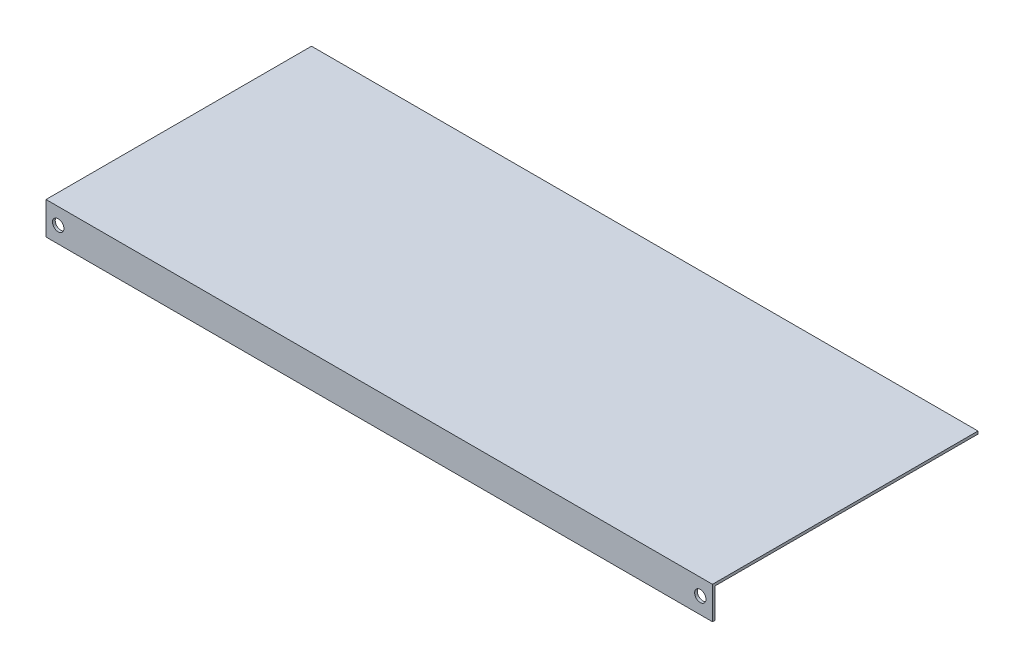
ISO-10303-21;
HEADER;
FILE_DESCRIPTION(('STEP AP214'),'2;1');
FILE_NAME('part.step','',(''),(''),'','','');
FILE_SCHEMA(('AUTOMOTIVE_DESIGN { 1 0 10303 214 1 1 1 1 }'));
ENDSEC;
DATA;
#1=APPLICATION_CONTEXT('core data for automotive mechanical design processes');
#2=APPLICATION_PROTOCOL_DEFINITION('international standard','automotive_design',2000,#1);
#3=PRODUCT_CONTEXT('',#1,'mechanical');
#4=PRODUCT('Part','Part','',(#3));
#5=PRODUCT_RELATED_PRODUCT_CATEGORY('part','',(#4));
#6=PRODUCT_DEFINITION_FORMATION('','',#4);
#7=PRODUCT_DEFINITION_CONTEXT('part definition',#1,'design');
#8=PRODUCT_DEFINITION('design','',#6,#7);
#9=PRODUCT_DEFINITION_SHAPE('','',#8);
#10=(LENGTH_UNIT() NAMED_UNIT(*) SI_UNIT(.MILLI.,.METRE.));
#11=(NAMED_UNIT(*) PLANE_ANGLE_UNIT() SI_UNIT($,.RADIAN.));
#12=(NAMED_UNIT(*) SI_UNIT($,.STERADIAN.) SOLID_ANGLE_UNIT());
#13=UNCERTAINTY_MEASURE_WITH_UNIT(LENGTH_MEASURE(1.E-05),#10,'distance_accuracy_value','');
#14=(GEOMETRIC_REPRESENTATION_CONTEXT(3) GLOBAL_UNCERTAINTY_ASSIGNED_CONTEXT((#13)) GLOBAL_UNIT_ASSIGNED_CONTEXT((#10,
#11,#12)) REPRESENTATION_CONTEXT('',''));
#15=CARTESIAN_POINT('',(0.,0.,0.));
#16=DIRECTION('',(0.,0.,1.));
#17=DIRECTION('',(1.,0.,0.));
#18=AXIS2_PLACEMENT_3D('',#15,#16,#17);
#19=CARTESIAN_POINT('',(123.,1.,49.));
#20=DIRECTION('',(-1.,0.,0.));
#21=DIRECTION('',(0.,0.,1.));
#22=AXIS2_PLACEMENT_3D('',#19,#20,#21);
#23=PLANE('',#22);
#24=DIRECTION('',(0.,-1.,0.));
#25=VECTOR('',#24,1.);
#26=CARTESIAN_POINT('',(123.,1.,49.));
#27=LINE('',#26,#25);
#28=CARTESIAN_POINT('',(123.,1.,49.));
#29=VERTEX_POINT('',#28);
#30=CARTESIAN_POINT('',(123.,-11.,49.));
#31=VERTEX_POINT('',#30);
#32=EDGE_CURVE('E130',#29,#31,#27,.T.);
#33=ORIENTED_EDGE('',*,*,#32,.T.);
#34=DIRECTION('',(0.,0.,1.));
#35=VECTOR('',#34,1.);
#36=CARTESIAN_POINT('',(123.,-11.,49.));
#37=LINE('',#36,#35);
#38=CARTESIAN_POINT('',(123.,-11.,48.));
#39=VERTEX_POINT('',#38);
#40=EDGE_CURVE('E106',#39,#31,#37,.T.);
#41=ORIENTED_EDGE('',*,*,#40,.F.);
#42=DIRECTION('',(0.,1.,0.));
#43=VECTOR('',#42,1.);
#44=CARTESIAN_POINT('',(123.,-11.,48.));
#45=LINE('',#44,#43);
#46=CARTESIAN_POINT('',(123.,0.,48.));
#47=VERTEX_POINT('',#46);
#48=EDGE_CURVE('E102',#39,#47,#45,.T.);
#49=ORIENTED_EDGE('',*,*,#48,.T.);
#50=DIRECTION('',(0.,0.,-1.));
#51=VECTOR('',#50,1.);
#52=CARTESIAN_POINT('',(123.,0.,49.));
#53=LINE('',#52,#51);
#54=CARTESIAN_POINT('',(123.,0.,-49.));
#55=VERTEX_POINT('',#54);
#56=EDGE_CURVE('E119',#47,#55,#53,.T.);
#57=ORIENTED_EDGE('',*,*,#56,.T.);
#58=DIRECTION('',(0.,-1.,0.));
#59=VECTOR('',#58,1.);
#60=CARTESIAN_POINT('',(123.,1.,-49.));
#61=LINE('',#60,#59);
#62=CARTESIAN_POINT('',(123.,1.,-49.));
#63=VERTEX_POINT('',#62);
#64=EDGE_CURVE('E11',#63,#55,#61,.T.);
#65=ORIENTED_EDGE('',*,*,#64,.F.);
#66=DIRECTION('',(0.,0.,-1.));
#67=VECTOR('',#66,1.);
#68=CARTESIAN_POINT('',(123.,1.,49.));
#69=LINE('',#68,#67);
#70=EDGE_CURVE('E125',#29,#63,#69,.T.);
#71=ORIENTED_EDGE('',*,*,#70,.F.);
#72=EDGE_LOOP('',(#33,#41,#49,#57,#65,#71));
#73=FACE_BOUND('',#72,.T.);
#74=ADVANCED_FACE('F35',(#73),#23,.F.);
#75=CARTESIAN_POINT('',(-123.,1.,-49.));
#76=DIRECTION('',(0.,0.,1.));
#77=DIRECTION('',(1.,0.,0.));
#78=AXIS2_PLACEMENT_3D('',#75,#76,#77);
#79=PLANE('',#78);
#80=DIRECTION('',(-1.,0.,0.));
#81=VECTOR('',#80,1.);
#82=CARTESIAN_POINT('',(-123.,0.,-49.));
#83=LINE('',#82,#81);
#84=CARTESIAN_POINT('',(-123.,0.,-49.));
#85=VERTEX_POINT('',#84);
#86=EDGE_CURVE('E74',#55,#85,#83,.T.);
#87=ORIENTED_EDGE('',*,*,#86,.T.);
#88=DIRECTION('',(0.,-1.,0.));
#89=VECTOR('',#88,1.);
#90=CARTESIAN_POINT('',(-123.,1.,-49.));
#91=LINE('',#90,#89);
#92=CARTESIAN_POINT('',(-123.,1.,-49.));
#93=VERTEX_POINT('',#92);
#94=EDGE_CURVE('E43',#93,#85,#91,.T.);
#95=ORIENTED_EDGE('',*,*,#94,.F.);
#96=DIRECTION('',(-1.,0.,0.));
#97=VECTOR('',#96,1.);
#98=CARTESIAN_POINT('',(-123.,1.,-49.));
#99=LINE('',#98,#97);
#100=EDGE_CURVE('E79',#63,#93,#99,.T.);
#101=ORIENTED_EDGE('',*,*,#100,.F.);
#102=ORIENTED_EDGE('',*,*,#64,.T.);
#103=EDGE_LOOP('',(#87,#95,#101,#102));
#104=FACE_BOUND('',#103,.T.);
#105=ADVANCED_FACE('F140',(#104),#79,.F.);
#106=CARTESIAN_POINT('',(-123.,1.,49.));
#107=DIRECTION('',(1.,0.,0.));
#108=DIRECTION('',(0.,0.,-1.));
#109=AXIS2_PLACEMENT_3D('',#106,#107,#108);
#110=PLANE('',#109);
#111=DIRECTION('',(0.,0.,1.));
#112=VECTOR('',#111,1.);
#113=CARTESIAN_POINT('',(-123.,0.,49.));
#114=LINE('',#113,#112);
#115=CARTESIAN_POINT('',(-123.,0.,48.));
#116=VERTEX_POINT('',#115);
#117=EDGE_CURVE('E118',#85,#116,#114,.T.);
#118=ORIENTED_EDGE('',*,*,#117,.T.);
#119=DIRECTION('',(0.,1.,0.));
#120=VECTOR('',#119,1.);
#121=CARTESIAN_POINT('',(-123.,-11.,48.));
#122=LINE('',#121,#120);
#123=CARTESIAN_POINT('',(-123.,-11.,48.));
#124=VERTEX_POINT('',#123);
#125=EDGE_CURVE('E100',#124,#116,#122,.T.);
#126=ORIENTED_EDGE('',*,*,#125,.F.);
#127=DIRECTION('',(0.,0.,-1.));
#128=VECTOR('',#127,1.);
#129=CARTESIAN_POINT('',(-123.,-11.,49.));
#130=LINE('',#129,#128);
#131=CARTESIAN_POINT('',(-123.,-11.,49.));
#132=VERTEX_POINT('',#131);
#133=EDGE_CURVE('E107',#132,#124,#130,.T.);
#134=ORIENTED_EDGE('',*,*,#133,.F.);
#135=DIRECTION('',(0.,-1.,0.));
#136=VECTOR('',#135,1.);
#137=CARTESIAN_POINT('',(-123.,1.,49.));
#138=LINE('',#137,#136);
#139=CARTESIAN_POINT('',(-123.,1.,49.));
#140=VERTEX_POINT('',#139);
#141=EDGE_CURVE('E135',#140,#132,#138,.T.);
#142=ORIENTED_EDGE('',*,*,#141,.F.);
#143=DIRECTION('',(0.,0.,1.));
#144=VECTOR('',#143,1.);
#145=CARTESIAN_POINT('',(-123.,1.,49.));
#146=LINE('',#145,#144);
#147=EDGE_CURVE('E128',#93,#140,#146,.T.);
#148=ORIENTED_EDGE('',*,*,#147,.F.);
#149=ORIENTED_EDGE('',*,*,#94,.T.);
#150=EDGE_LOOP('',(#118,#126,#134,#142,#148,#149));
#151=FACE_BOUND('',#150,.T.);
#152=ADVANCED_FACE('F117',(#151),#110,.F.);
#153=CARTESIAN_POINT('',(-123.,1.,49.));
#154=DIRECTION('',(0.,0.,-1.));
#155=DIRECTION('',(-1.,0.,0.));
#156=AXIS2_PLACEMENT_3D('',#153,#154,#155);
#157=PLANE('',#156);
#158=CARTESIAN_POINT('',(118.5,-5.,49.));
#159=DIRECTION('',(0.,0.,1.));
#160=DIRECTION('',(1.,0.,0.));
#161=AXIS2_PLACEMENT_3D('',#158,#159,#160);
#162=CIRCLE('',#161,2.1);
#163=CARTESIAN_POINT('',(120.6,-5.,49.));
#164=VERTEX_POINT('',#163);
#165=EDGE_CURVE('E154',#164,#164,#162,.T.);
#166=ORIENTED_EDGE('',*,*,#165,.F.);
#167=EDGE_LOOP('',(#166));
#168=FACE_BOUND('',#167,.T.);
#169=CARTESIAN_POINT('',(-118.5,-5.00000000000007,49.));
#170=DIRECTION('',(0.,0.,1.));
#171=DIRECTION('',(1.,0.,0.));
#172=AXIS2_PLACEMENT_3D('',#169,#170,#171);
#173=CIRCLE('',#172,2.1);
#174=CARTESIAN_POINT('',(-116.4,-5.00000000000007,49.));
#175=VERTEX_POINT('',#174);
#176=EDGE_CURVE('E147',#175,#175,#173,.T.);
#177=ORIENTED_EDGE('',*,*,#176,.F.);
#178=EDGE_LOOP('',(#177));
#179=FACE_BOUND('',#178,.T.);
#180=ORIENTED_EDGE('',*,*,#141,.T.);
#181=DIRECTION('',(-1.,0.,0.));
#182=VECTOR('',#181,1.);
#183=CARTESIAN_POINT('',(-123.,-11.,49.));
#184=LINE('',#183,#182);
#185=EDGE_CURVE('E113',#31,#132,#184,.T.);
#186=ORIENTED_EDGE('',*,*,#185,.F.);
#187=ORIENTED_EDGE('',*,*,#32,.F.);
#188=DIRECTION('',(1.,0.,0.));
#189=VECTOR('',#188,1.);
#190=CARTESIAN_POINT('',(-123.,1.,49.));
#191=LINE('',#190,#189);
#192=EDGE_CURVE('E59',#140,#29,#191,.T.);
#193=ORIENTED_EDGE('',*,*,#192,.F.);
#194=EDGE_LOOP('',(#180,#186,#187,#193));
#195=FACE_BOUND('',#194,.T.);
#196=ADVANCED_FACE('F178',(#168,#179,#195),#157,.F.);
#197=CARTESIAN_POINT('',(0.,1.,0.));
#198=DIRECTION('',(0.,-1.,0.));
#199=DIRECTION('',(0.,0.,-1.));
#200=AXIS2_PLACEMENT_3D('',#197,#198,#199);
#201=PLANE('',#200);
#202=ORIENTED_EDGE('',*,*,#70,.T.);
#203=ORIENTED_EDGE('',*,*,#100,.T.);
#204=ORIENTED_EDGE('',*,*,#147,.T.);
#205=ORIENTED_EDGE('',*,*,#192,.T.);
#206=EDGE_LOOP('',(#202,#203,#204,#205));
#207=FACE_BOUND('',#206,.T.);
#208=ADVANCED_FACE('F183',(#207),#201,.F.);
#209=CARTESIAN_POINT('',(0.,0.,0.));
#210=DIRECTION('',(0.,-1.,0.));
#211=DIRECTION('',(0.,0.,-1.));
#212=AXIS2_PLACEMENT_3D('',#209,#210,#211);
#213=PLANE('',#212);
#214=DIRECTION('',(1.,0.,0.));
#215=VECTOR('',#214,1.);
#216=CARTESIAN_POINT('',(-123.,0.,48.));
#217=LINE('',#216,#215);
#218=EDGE_CURVE('E50',#116,#47,#217,.T.);
#219=ORIENTED_EDGE('',*,*,#218,.F.);
#220=ORIENTED_EDGE('',*,*,#117,.F.);
#221=ORIENTED_EDGE('',*,*,#86,.F.);
#222=ORIENTED_EDGE('',*,*,#56,.F.);
#223=EDGE_LOOP('',(#219,#220,#221,#222));
#224=FACE_BOUND('',#223,.T.);
#225=ADVANCED_FACE('F138',(#224),#213,.T.);
#226=CARTESIAN_POINT('',(-123.,-11.,48.));
#227=DIRECTION('',(0.,0.,1.));
#228=DIRECTION('',(1.,0.,0.));
#229=AXIS2_PLACEMENT_3D('',#226,#227,#228);
#230=PLANE('',#229);
#231=CARTESIAN_POINT('',(118.5,-5.,48.));
#232=DIRECTION('',(0.,0.,1.));
#233=DIRECTION('',(1.,0.,0.));
#234=AXIS2_PLACEMENT_3D('',#231,#232,#233);
#235=CIRCLE('',#234,2.1);
#236=CARTESIAN_POINT('',(120.6,-5.,48.));
#237=VERTEX_POINT('',#236);
#238=EDGE_CURVE('E38',#237,#237,#235,.T.);
#239=ORIENTED_EDGE('',*,*,#238,.T.);
#240=EDGE_LOOP('',(#239));
#241=FACE_BOUND('',#240,.T.);
#242=CARTESIAN_POINT('',(-118.5,-5.00000000000007,48.));
#243=DIRECTION('',(0.,0.,1.));
#244=DIRECTION('',(1.,0.,0.));
#245=AXIS2_PLACEMENT_3D('',#242,#243,#244);
#246=CIRCLE('',#245,2.1);
#247=CARTESIAN_POINT('',(-116.4,-5.00000000000007,48.));
#248=VERTEX_POINT('',#247);
#249=EDGE_CURVE('E145',#248,#248,#246,.T.);
#250=ORIENTED_EDGE('',*,*,#249,.T.);
#251=EDGE_LOOP('',(#250));
#252=FACE_BOUND('',#251,.T.);
#253=ORIENTED_EDGE('',*,*,#218,.T.);
#254=ORIENTED_EDGE('',*,*,#48,.F.);
#255=DIRECTION('',(1.,0.,0.));
#256=VECTOR('',#255,1.);
#257=CARTESIAN_POINT('',(-123.,-11.,48.));
#258=LINE('',#257,#256);
#259=EDGE_CURVE('E96',#124,#39,#258,.T.);
#260=ORIENTED_EDGE('',*,*,#259,.F.);
#261=ORIENTED_EDGE('',*,*,#125,.T.);
#262=EDGE_LOOP('',(#253,#254,#260,#261));
#263=FACE_BOUND('',#262,.T.);
#264=ADVANCED_FACE('F98',(#241,#252,#263),#230,.F.);
#265=CARTESIAN_POINT('',(0.,-11.,0.));
#266=DIRECTION('',(0.,-1.,0.));
#267=DIRECTION('',(0.,0.,-1.));
#268=AXIS2_PLACEMENT_3D('',#265,#266,#267);
#269=PLANE('',#268);
#270=ORIENTED_EDGE('',*,*,#133,.T.);
#271=ORIENTED_EDGE('',*,*,#259,.T.);
#272=ORIENTED_EDGE('',*,*,#40,.T.);
#273=ORIENTED_EDGE('',*,*,#185,.T.);
#274=EDGE_LOOP('',(#270,#271,#272,#273));
#275=FACE_BOUND('',#274,.T.);
#276=ADVANCED_FACE('F111',(#275),#269,.T.);
#277=CARTESIAN_POINT('',(-118.5,-5.00000000000007,49.));
#278=DIRECTION('',(0.,0.,1.));
#279=DIRECTION('',(1.,0.,0.));
#280=AXIS2_PLACEMENT_3D('',#277,#278,#279);
#281=CYLINDRICAL_SURFACE('',#280,2.1);
#282=ORIENTED_EDGE('',*,*,#176,.T.);
#283=EDGE_LOOP('',(#282));
#284=FACE_BOUND('',#283,.T.);
#285=ORIENTED_EDGE('',*,*,#249,.F.);
#286=EDGE_LOOP('',(#285));
#287=FACE_BOUND('',#286,.T.);
#288=ADVANCED_FACE('F164',(#284,#287),#281,.F.);
#289=CARTESIAN_POINT('',(118.5,-5.,49.));
#290=DIRECTION('',(0.,0.,1.));
#291=DIRECTION('',(1.,0.,0.));
#292=AXIS2_PLACEMENT_3D('',#289,#290,#291);
#293=CYLINDRICAL_SURFACE('',#292,2.1);
#294=ORIENTED_EDGE('',*,*,#165,.T.);
#295=EDGE_LOOP('',(#294));
#296=FACE_BOUND('',#295,.T.);
#297=ORIENTED_EDGE('',*,*,#238,.F.);
#298=EDGE_LOOP('',(#297));
#299=FACE_BOUND('',#298,.T.);
#300=ADVANCED_FACE('F162',(#296,#299),#293,.F.);
#301=CLOSED_SHELL('',(#74,#105,#152,#196,#208,#225,#264,#276,#288,#300));
#302=MANIFOLD_SOLID_BREP('B2',#301);
#303=ADVANCED_BREP_SHAPE_REPRESENTATION('',(#18,#302),#14);
#304=SHAPE_DEFINITION_REPRESENTATION(#9,#303);
ENDSEC;
END-ISO-10303-21;
